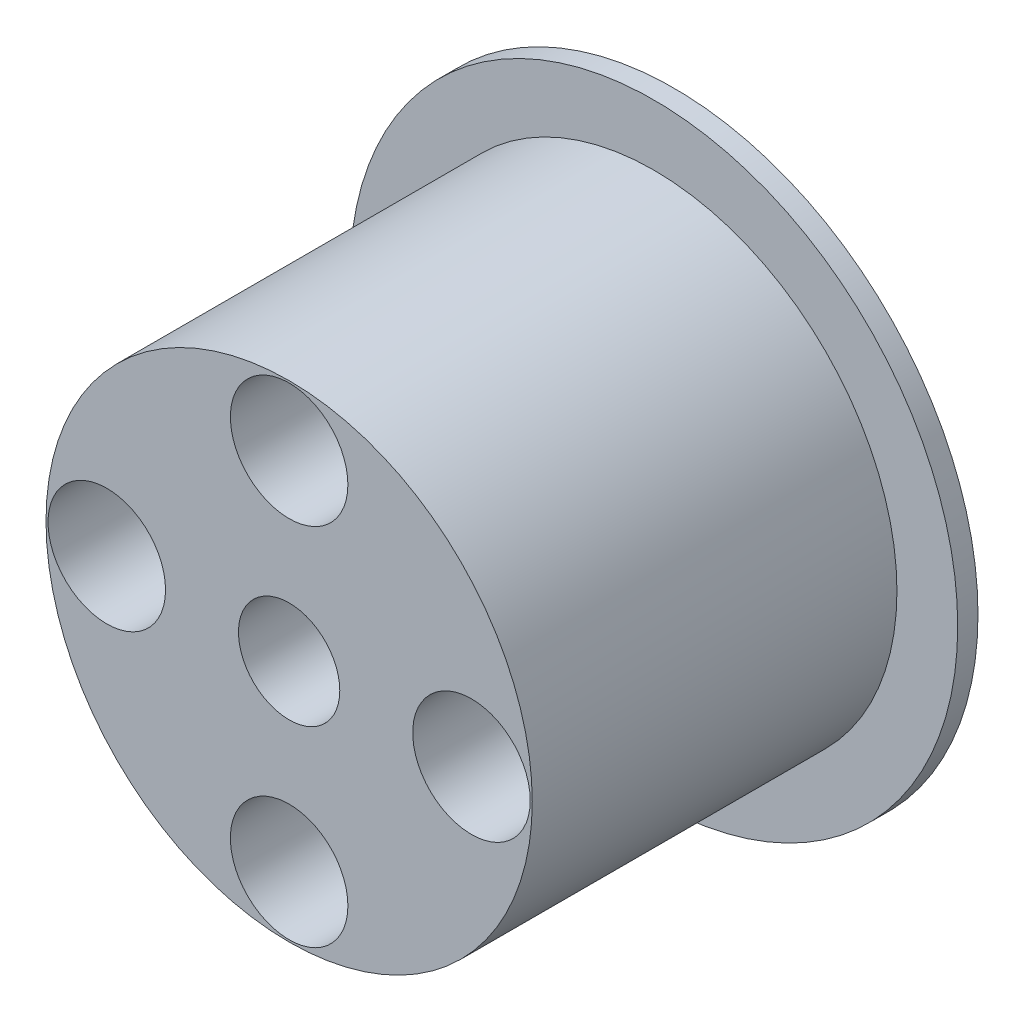
ISO-10303-21;
HEADER;
FILE_DESCRIPTION(('STEP AP214'),'2;1');
FILE_NAME('part.step','',(''),(''),'','','');
FILE_SCHEMA(('AUTOMOTIVE_DESIGN { 1 0 10303 214 1 1 1 1 }'));
ENDSEC;
DATA;
#1=APPLICATION_CONTEXT('core data for automotive mechanical design processes');
#2=APPLICATION_PROTOCOL_DEFINITION('international standard','automotive_design',2000,#1);
#3=PRODUCT_CONTEXT('',#1,'mechanical');
#4=PRODUCT('Part','Part','',(#3));
#5=PRODUCT_RELATED_PRODUCT_CATEGORY('part','',(#4));
#6=PRODUCT_DEFINITION_FORMATION('','',#4);
#7=PRODUCT_DEFINITION_CONTEXT('part definition',#1,'design');
#8=PRODUCT_DEFINITION('design','',#6,#7);
#9=PRODUCT_DEFINITION_SHAPE('','',#8);
#10=(LENGTH_UNIT() NAMED_UNIT(*) SI_UNIT(.MILLI.,.METRE.));
#11=(NAMED_UNIT(*) PLANE_ANGLE_UNIT() SI_UNIT($,.RADIAN.));
#12=(NAMED_UNIT(*) SI_UNIT($,.STERADIAN.) SOLID_ANGLE_UNIT());
#13=UNCERTAINTY_MEASURE_WITH_UNIT(LENGTH_MEASURE(1.E-05),#10,'distance_accuracy_value','');
#14=(GEOMETRIC_REPRESENTATION_CONTEXT(3) GLOBAL_UNCERTAINTY_ASSIGNED_CONTEXT((#13)) GLOBAL_UNIT_ASSIGNED_CONTEXT((#10,
#11,#12)) REPRESENTATION_CONTEXT('',''));
#15=CARTESIAN_POINT('',(0.,0.,0.));
#16=DIRECTION('',(0.,0.,1.));
#17=DIRECTION('',(1.,0.,0.));
#18=AXIS2_PLACEMENT_3D('',#15,#16,#17);
#19=CARTESIAN_POINT('',(0.,2.,-5.));
#20=DIRECTION('',(0.,-1.,0.));
#21=DIRECTION('',(0.,0.,-1.));
#22=AXIS2_PLACEMENT_3D('',#19,#20,#21);
#23=PLANE('',#22);
#24=DIRECTION('',(0.,0.,1.));
#25=VECTOR('',#24,1.);
#26=CARTESIAN_POINT('',(1.5,2.,-5.));
#27=LINE('',#26,#25);
#28=CARTESIAN_POINT('',(1.5,2.,-1.));
#29=VERTEX_POINT('',#28);
#30=CARTESIAN_POINT('',(1.5,2.,13.));
#31=VERTEX_POINT('',#30);
#32=EDGE_CURVE('E88',#29,#31,#27,.T.);
#33=ORIENTED_EDGE('',*,*,#32,.T.);
#34=DIRECTION('',(-1.,0.,0.));
#35=VECTOR('',#34,1.);
#36=CARTESIAN_POINT('',(0.,2.,13.));
#37=LINE('',#36,#35);
#38=CARTESIAN_POINT('',(-1.5,2.,13.));
#39=VERTEX_POINT('',#38);
#40=EDGE_CURVE('E93',#31,#39,#37,.T.);
#41=ORIENTED_EDGE('',*,*,#40,.T.);
#42=DIRECTION('',(0.,0.,1.));
#43=VECTOR('',#42,1.);
#44=CARTESIAN_POINT('',(-1.5,2.,-5.));
#45=LINE('',#44,#43);
#46=CARTESIAN_POINT('',(-1.5,2.,-1.));
#47=VERTEX_POINT('',#46);
#48=EDGE_CURVE('E101',#47,#39,#45,.T.);
#49=ORIENTED_EDGE('',*,*,#48,.F.);
#50=DIRECTION('',(-1.,0.,0.));
#51=VECTOR('',#50,1.);
#52=CARTESIAN_POINT('',(0.,2.,-1.));
#53=LINE('',#52,#51);
#54=EDGE_CURVE('E13',#29,#47,#53,.T.);
#55=ORIENTED_EDGE('',*,*,#54,.F.);
#56=EDGE_LOOP('',(#33,#41,#49,#55));
#57=FACE_BOUND('',#56,.T.);
#58=ADVANCED_FACE('F67',(#57),#23,.T.);
#59=CARTESIAN_POINT('',(0.,0.,18.));
#60=DIRECTION('',(0.,0.,1.));
#61=DIRECTION('',(1.,0.,0.));
#62=AXIS2_PLACEMENT_3D('',#59,#60,#61);
#63=PLANE('',#62);
#64=CARTESIAN_POINT('',(0.,0.,18.));
#65=DIRECTION('',(0.,0.,1.));
#66=DIRECTION('',(1.,0.,0.));
#67=AXIS2_PLACEMENT_3D('',#64,#65,#66);
#68=CIRCLE('',#67,2.5);
#69=CARTESIAN_POINT('',(2.5,0.,18.));
#70=VERTEX_POINT('',#69);
#71=EDGE_CURVE('E98',#70,#70,#68,.T.);
#72=ORIENTED_EDGE('',*,*,#71,.F.);
#73=EDGE_LOOP('',(#72));
#74=FACE_BOUND('',#73,.T.);
#75=CARTESIAN_POINT('',(0.,9.,18.));
#76=DIRECTION('',(0.,0.,1.));
#77=DIRECTION('',(1.,0.,0.));
#78=AXIS2_PLACEMENT_3D('',#75,#76,#77);
#79=CIRCLE('',#78,2.9);
#80=CARTESIAN_POINT('',(2.90000000000009,9.,18.));
#81=VERTEX_POINT('',#80);
#82=EDGE_CURVE('E112',#81,#81,#79,.T.);
#83=ORIENTED_EDGE('',*,*,#82,.F.);
#84=EDGE_LOOP('',(#83));
#85=FACE_BOUND('',#84,.T.);
#86=CARTESIAN_POINT('',(9.,-1.25693328198353E-13,18.));
#87=DIRECTION('',(0.,0.,1.));
#88=DIRECTION('',(1.,0.,0.));
#89=AXIS2_PLACEMENT_3D('',#86,#87,#88);
#90=CIRCLE('',#89,2.9);
#91=CARTESIAN_POINT('',(11.9,-1.25693328198353E-13,18.));
#92=VERTEX_POINT('',#91);
#93=EDGE_CURVE('E116',#92,#92,#90,.T.);
#94=ORIENTED_EDGE('',*,*,#93,.F.);
#95=EDGE_LOOP('',(#94));
#96=FACE_BOUND('',#95,.T.);
#97=CARTESIAN_POINT('',(-1.57116660247941E-13,-9.,18.));
#98=DIRECTION('',(0.,0.,1.));
#99=DIRECTION('',(1.,0.,0.));
#100=AXIS2_PLACEMENT_3D('',#97,#98,#99);
#101=CIRCLE('',#100,2.9);
#102=CARTESIAN_POINT('',(2.89999999999984,-9.,18.));
#103=VERTEX_POINT('',#102);
#104=EDGE_CURVE('E123',#103,#103,#101,.T.);
#105=ORIENTED_EDGE('',*,*,#104,.F.);
#106=EDGE_LOOP('',(#105));
#107=FACE_BOUND('',#106,.T.);
#108=CARTESIAN_POINT('',(-9.,1.90274715773506E-13,18.));
#109=DIRECTION('',(0.,0.,1.));
#110=DIRECTION('',(1.,0.,0.));
#111=AXIS2_PLACEMENT_3D('',#108,#109,#110);
#112=CIRCLE('',#111,2.9);
#113=CARTESIAN_POINT('',(-6.1,1.90274715773506E-13,18.));
#114=VERTEX_POINT('',#113);
#115=EDGE_CURVE('E107',#114,#114,#112,.T.);
#116=ORIENTED_EDGE('',*,*,#115,.F.);
#117=EDGE_LOOP('',(#116));
#118=FACE_BOUND('',#117,.T.);
#119=CARTESIAN_POINT('',(0.,0.,18.));
#120=DIRECTION('',(0.,0.,1.));
#121=DIRECTION('',(1.,0.,0.));
#122=AXIS2_PLACEMENT_3D('',#119,#120,#121);
#123=CIRCLE('',#122,12.);
#124=CARTESIAN_POINT('',(12.,0.,18.));
#125=VERTEX_POINT('',#124);
#126=EDGE_CURVE('E153',#125,#125,#123,.T.);
#127=ORIENTED_EDGE('',*,*,#126,.T.);
#128=EDGE_LOOP('',(#127));
#129=FACE_BOUND('',#128,.T.);
#130=ADVANCED_FACE('F170',(#74,#85,#96,#107,#118,#129),#63,.T.);
#131=CARTESIAN_POINT('',(0.,0.,-1.));
#132=DIRECTION('',(0.,0.,-1.));
#133=DIRECTION('',(-1.,0.,0.));
#134=AXIS2_PLACEMENT_3D('',#131,#132,#133);
#135=PLANE('',#134);
#136=CARTESIAN_POINT('',(0.,-9.,-1.));
#137=DIRECTION('',(0.,0.,-1.));
#138=DIRECTION('',(-1.,0.,0.));
#139=AXIS2_PLACEMENT_3D('',#136,#137,#138);
#140=CIRCLE('',#139,1.5);
#141=CARTESIAN_POINT('',(-1.50000000000003,-9.,-1.));
#142=VERTEX_POINT('',#141);
#143=EDGE_CURVE('E136',#142,#142,#140,.T.);
#144=ORIENTED_EDGE('',*,*,#143,.F.);
#145=EDGE_LOOP('',(#144));
#146=FACE_BOUND('',#145,.T.);
#147=CARTESIAN_POINT('',(0.,9.,-1.));
#148=DIRECTION('',(0.,0.,-1.));
#149=DIRECTION('',(-1.,0.,0.));
#150=AXIS2_PLACEMENT_3D('',#147,#148,#149);
#151=CIRCLE('',#150,1.5);
#152=CARTESIAN_POINT('',(-1.4999999999999,9.,-1.));
#153=VERTEX_POINT('',#152);
#154=EDGE_CURVE('E143',#153,#153,#151,.T.);
#155=ORIENTED_EDGE('',*,*,#154,.F.);
#156=EDGE_LOOP('',(#155));
#157=FACE_BOUND('',#156,.T.);
#158=CARTESIAN_POINT('',(0.,0.,-1.));
#159=DIRECTION('',(0.,0.,-1.));
#160=DIRECTION('',(-1.,0.,0.));
#161=AXIS2_PLACEMENT_3D('',#158,#159,#160);
#162=CIRCLE('',#161,15.);
#163=CARTESIAN_POINT('',(-15.,0.,-1.));
#164=VERTEX_POINT('',#163);
#165=EDGE_CURVE('E147',#164,#164,#162,.T.);
#166=ORIENTED_EDGE('',*,*,#165,.T.);
#167=EDGE_LOOP('',(#166));
#168=FACE_BOUND('',#167,.T.);
#169=CARTESIAN_POINT('',(-9.,0.,-1.));
#170=DIRECTION('',(0.,0.,-1.));
#171=DIRECTION('',(-1.,0.,0.));
#172=AXIS2_PLACEMENT_3D('',#169,#170,#171);
#173=CIRCLE('',#172,1.5);
#174=CARTESIAN_POINT('',(-10.5,0.,-1.));
#175=VERTEX_POINT('',#174);
#176=EDGE_CURVE('E140',#175,#175,#173,.T.);
#177=ORIENTED_EDGE('',*,*,#176,.F.);
#178=EDGE_LOOP('',(#177));
#179=FACE_BOUND('',#178,.T.);
#180=CARTESIAN_POINT('',(9.,0.,-1.));
#181=DIRECTION('',(0.,0.,-1.));
#182=DIRECTION('',(-1.,0.,0.));
#183=AXIS2_PLACEMENT_3D('',#180,#181,#182);
#184=CIRCLE('',#183,1.5);
#185=CARTESIAN_POINT('',(7.5,0.,-1.));
#186=VERTEX_POINT('',#185);
#187=EDGE_CURVE('E133',#186,#186,#184,.T.);
#188=ORIENTED_EDGE('',*,*,#187,.F.);
#189=EDGE_LOOP('',(#188));
#190=FACE_BOUND('',#189,.T.);
#191=CARTESIAN_POINT('',(0.,0.,-1.));
#192=DIRECTION('',(0.,0.,-1.));
#193=DIRECTION('',(-1.,0.,0.));
#194=AXIS2_PLACEMENT_3D('',#191,#192,#193);
#195=CIRCLE('',#194,2.5);
#196=EDGE_CURVE('E75',#29,#47,#195,.T.);
#197=ORIENTED_EDGE('',*,*,#196,.F.);
#198=ORIENTED_EDGE('',*,*,#54,.T.);
#199=EDGE_LOOP('',(#197,#198));
#200=FACE_BOUND('',#199,.T.);
#201=ADVANCED_FACE('F168',(#146,#157,#168,#179,#190,#200),#135,.T.);
#202=CARTESIAN_POINT('',(0.,0.,18.));
#203=DIRECTION('',(0.,0.,-1.));
#204=DIRECTION('',(-1.,0.,0.));
#205=AXIS2_PLACEMENT_3D('',#202,#203,#204);
#206=CYLINDRICAL_SURFACE('',#205,12.);
#207=ORIENTED_EDGE('',*,*,#126,.F.);
#208=EDGE_LOOP('',(#207));
#209=FACE_BOUND('',#208,.T.);
#210=CARTESIAN_POINT('',(0.,0.,0.));
#211=DIRECTION('',(0.,0.,1.));
#212=DIRECTION('',(1.,0.,0.));
#213=AXIS2_PLACEMENT_3D('',#210,#211,#212);
#214=CIRCLE('',#213,12.);
#215=CARTESIAN_POINT('',(12.,0.,0.));
#216=VERTEX_POINT('',#215);
#217=EDGE_CURVE('E150',#216,#216,#214,.T.);
#218=ORIENTED_EDGE('',*,*,#217,.T.);
#219=EDGE_LOOP('',(#218));
#220=FACE_BOUND('',#219,.T.);
#221=ADVANCED_FACE('F69',(#209,#220),#206,.T.);
#222=CARTESIAN_POINT('',(-9.,0.,18.));
#223=DIRECTION('',(0.,0.,-1.));
#224=DIRECTION('',(-1.,0.,0.));
#225=AXIS2_PLACEMENT_3D('',#222,#223,#224);
#226=CYLINDRICAL_SURFACE('',#225,1.5);
#227=CARTESIAN_POINT('',(-9.,0.,4.));
#228=DIRECTION('',(0.,0.,-1.));
#229=DIRECTION('',(-1.,0.,0.));
#230=AXIS2_PLACEMENT_3D('',#227,#228,#229);
#231=CIRCLE('',#230,1.5);
#232=CARTESIAN_POINT('',(-10.5,0.,4.));
#233=VERTEX_POINT('',#232);
#234=EDGE_CURVE('E137',#233,#233,#231,.T.);
#235=ORIENTED_EDGE('',*,*,#234,.F.);
#236=EDGE_LOOP('',(#235));
#237=FACE_BOUND('',#236,.T.);
#238=ORIENTED_EDGE('',*,*,#176,.T.);
#239=EDGE_LOOP('',(#238));
#240=FACE_BOUND('',#239,.T.);
#241=ADVANCED_FACE('F178',(#237,#240),#226,.F.);
#242=CARTESIAN_POINT('',(9.,0.,18.));
#243=DIRECTION('',(0.,0.,-1.));
#244=DIRECTION('',(-1.,0.,0.));
#245=AXIS2_PLACEMENT_3D('',#242,#243,#244);
#246=CYLINDRICAL_SURFACE('',#245,1.5);
#247=CARTESIAN_POINT('',(9.,0.,4.));
#248=DIRECTION('',(0.,0.,-1.));
#249=DIRECTION('',(-1.,0.,0.));
#250=AXIS2_PLACEMENT_3D('',#247,#248,#249);
#251=CIRCLE('',#250,1.5);
#252=CARTESIAN_POINT('',(7.5,0.,4.));
#253=VERTEX_POINT('',#252);
#254=EDGE_CURVE('E163',#253,#253,#251,.T.);
#255=ORIENTED_EDGE('',*,*,#254,.F.);
#256=EDGE_LOOP('',(#255));
#257=FACE_BOUND('',#256,.T.);
#258=ORIENTED_EDGE('',*,*,#187,.T.);
#259=EDGE_LOOP('',(#258));
#260=FACE_BOUND('',#259,.T.);
#261=ADVANCED_FACE('F256',(#257,#260),#246,.F.);
#262=CARTESIAN_POINT('',(0.,9.,18.));
#263=DIRECTION('',(0.,0.,-1.));
#264=DIRECTION('',(-1.,0.,0.));
#265=AXIS2_PLACEMENT_3D('',#262,#263,#264);
#266=CYLINDRICAL_SURFACE('',#265,1.5);
#267=CARTESIAN_POINT('',(0.,9.,4.));
#268=DIRECTION('',(0.,0.,-1.));
#269=DIRECTION('',(-1.,0.,0.));
#270=AXIS2_PLACEMENT_3D('',#267,#268,#269);
#271=CIRCLE('',#270,1.5);
#272=CARTESIAN_POINT('',(-1.4999999999999,9.,4.));
#273=VERTEX_POINT('',#272);
#274=EDGE_CURVE('E160',#273,#273,#271,.T.);
#275=ORIENTED_EDGE('',*,*,#274,.F.);
#276=EDGE_LOOP('',(#275));
#277=FACE_BOUND('',#276,.T.);
#278=ORIENTED_EDGE('',*,*,#154,.T.);
#279=EDGE_LOOP('',(#278));
#280=FACE_BOUND('',#279,.T.);
#281=ADVANCED_FACE('F252',(#277,#280),#266,.F.);
#282=CARTESIAN_POINT('',(0.,-9.,18.));
#283=DIRECTION('',(0.,0.,-1.));
#284=DIRECTION('',(-1.,0.,0.));
#285=AXIS2_PLACEMENT_3D('',#282,#283,#284);
#286=CYLINDRICAL_SURFACE('',#285,1.5);
#287=CARTESIAN_POINT('',(0.,-9.,4.));
#288=DIRECTION('',(0.,0.,-1.));
#289=DIRECTION('',(-1.,0.,0.));
#290=AXIS2_PLACEMENT_3D('',#287,#288,#289);
#291=CIRCLE('',#290,1.5);
#292=CARTESIAN_POINT('',(-1.50000000000003,-9.,4.));
#293=VERTEX_POINT('',#292);
#294=EDGE_CURVE('E119',#293,#293,#291,.T.);
#295=ORIENTED_EDGE('',*,*,#294,.F.);
#296=EDGE_LOOP('',(#295));
#297=FACE_BOUND('',#296,.T.);
#298=ORIENTED_EDGE('',*,*,#143,.T.);
#299=EDGE_LOOP('',(#298));
#300=FACE_BOUND('',#299,.T.);
#301=ADVANCED_FACE('F239',(#297,#300),#286,.F.);
#302=CARTESIAN_POINT('',(0.,0.,0.));
#303=DIRECTION('',(0.,0.,-1.));
#304=DIRECTION('',(-1.,0.,0.));
#305=AXIS2_PLACEMENT_3D('',#302,#303,#304);
#306=PLANE('',#305);
#307=ORIENTED_EDGE('',*,*,#217,.F.);
#308=EDGE_LOOP('',(#307));
#309=FACE_BOUND('',#308,.T.);
#310=CARTESIAN_POINT('',(0.,0.,0.));
#311=DIRECTION('',(0.,0.,-1.));
#312=DIRECTION('',(-1.,0.,0.));
#313=AXIS2_PLACEMENT_3D('',#310,#311,#312);
#314=CIRCLE('',#313,15.);
#315=CARTESIAN_POINT('',(-15.,0.,0.));
#316=VERTEX_POINT('',#315);
#317=EDGE_CURVE('E146',#316,#316,#314,.T.);
#318=ORIENTED_EDGE('',*,*,#317,.F.);
#319=EDGE_LOOP('',(#318));
#320=FACE_BOUND('',#319,.T.);
#321=ADVANCED_FACE('F236',(#309,#320),#306,.F.);
#322=CARTESIAN_POINT('',(0.,0.,-1.));
#323=DIRECTION('',(0.,0.,1.));
#324=DIRECTION('',(1.,0.,0.));
#325=AXIS2_PLACEMENT_3D('',#322,#323,#324);
#326=CYLINDRICAL_SURFACE('',#325,15.);
#327=ORIENTED_EDGE('',*,*,#165,.F.);
#328=EDGE_LOOP('',(#327));
#329=FACE_BOUND('',#328,.T.);
#330=ORIENTED_EDGE('',*,*,#317,.T.);
#331=EDGE_LOOP('',(#330));
#332=FACE_BOUND('',#331,.T.);
#333=ADVANCED_FACE('F213',(#329,#332),#326,.T.);
#334=CARTESIAN_POINT('',(0.,0.,4.));
#335=DIRECTION('',(0.,0.,-1.));
#336=DIRECTION('',(-1.,0.,0.));
#337=AXIS2_PLACEMENT_3D('',#334,#335,#336);
#338=PLANE('',#337);
#339=ORIENTED_EDGE('',*,*,#294,.T.);
#340=EDGE_LOOP('',(#339));
#341=FACE_BOUND('',#340,.T.);
#342=CARTESIAN_POINT('',(-1.57116660247941E-13,-9.,4.));
#343=DIRECTION('',(0.,0.,-1.));
#344=DIRECTION('',(-1.,0.,0.));
#345=AXIS2_PLACEMENT_3D('',#342,#343,#344);
#346=CIRCLE('',#345,2.9);
#347=CARTESIAN_POINT('',(-2.90000000000016,-9.,4.));
#348=VERTEX_POINT('',#347);
#349=EDGE_CURVE('E126',#348,#348,#346,.F.);
#350=ORIENTED_EDGE('',*,*,#349,.T.);
#351=EDGE_LOOP('',(#350));
#352=FACE_BOUND('',#351,.T.);
#353=ADVANCED_FACE('F210',(#341,#352),#338,.F.);
#354=CARTESIAN_POINT('',(-1.57116660247941E-13,-9.,-9.20243866176395));
#355=DIRECTION('',(0.,0.,1.));
#356=DIRECTION('',(1.,0.,0.));
#357=AXIS2_PLACEMENT_3D('',#354,#355,#356);
#358=CYLINDRICAL_SURFACE('',#357,2.9);
#359=ORIENTED_EDGE('',*,*,#104,.T.);
#360=EDGE_LOOP('',(#359));
#361=FACE_BOUND('',#360,.T.);
#362=ORIENTED_EDGE('',*,*,#349,.F.);
#363=EDGE_LOOP('',(#362));
#364=FACE_BOUND('',#363,.T.);
#365=ADVANCED_FACE('F200',(#361,#364),#358,.F.);
#366=CARTESIAN_POINT('',(0.,0.,4.));
#367=DIRECTION('',(0.,0.,-1.));
#368=DIRECTION('',(-1.,0.,0.));
#369=AXIS2_PLACEMENT_3D('',#366,#367,#368);
#370=PLANE('',#369);
#371=ORIENTED_EDGE('',*,*,#274,.T.);
#372=EDGE_LOOP('',(#371));
#373=FACE_BOUND('',#372,.T.);
#374=CARTESIAN_POINT('',(0.,9.,4.));
#375=DIRECTION('',(0.,0.,-1.));
#376=DIRECTION('',(-1.,0.,0.));
#377=AXIS2_PLACEMENT_3D('',#374,#375,#376);
#378=CIRCLE('',#377,2.9);
#379=CARTESIAN_POINT('',(-2.89999999999991,9.,4.));
#380=VERTEX_POINT('',#379);
#381=EDGE_CURVE('E115',#380,#380,#378,.F.);
#382=ORIENTED_EDGE('',*,*,#381,.T.);
#383=EDGE_LOOP('',(#382));
#384=FACE_BOUND('',#383,.T.);
#385=ADVANCED_FACE('F196',(#373,#384),#370,.F.);
#386=CARTESIAN_POINT('',(0.,9.,-9.20243866176395));
#387=DIRECTION('',(0.,0.,1.));
#388=DIRECTION('',(1.,0.,0.));
#389=AXIS2_PLACEMENT_3D('',#386,#387,#388);
#390=CYLINDRICAL_SURFACE('',#389,2.9);
#391=ORIENTED_EDGE('',*,*,#82,.T.);
#392=EDGE_LOOP('',(#391));
#393=FACE_BOUND('',#392,.T.);
#394=ORIENTED_EDGE('',*,*,#381,.F.);
#395=EDGE_LOOP('',(#394));
#396=FACE_BOUND('',#395,.T.);
#397=ADVANCED_FACE('F192',(#393,#396),#390,.F.);
#398=CARTESIAN_POINT('',(0.,0.,4.));
#399=DIRECTION('',(0.,0.,-1.));
#400=DIRECTION('',(-1.,0.,0.));
#401=AXIS2_PLACEMENT_3D('',#398,#399,#400);
#402=PLANE('',#401);
#403=ORIENTED_EDGE('',*,*,#254,.T.);
#404=EDGE_LOOP('',(#403));
#405=FACE_BOUND('',#404,.T.);
#406=CARTESIAN_POINT('',(9.,-1.25693328198353E-13,4.));
#407=DIRECTION('',(0.,0.,-1.));
#408=DIRECTION('',(-1.,0.,0.));
#409=AXIS2_PLACEMENT_3D('',#406,#407,#408);
#410=CIRCLE('',#409,2.9);
#411=CARTESIAN_POINT('',(6.1,-1.25693328198353E-13,4.));
#412=VERTEX_POINT('',#411);
#413=EDGE_CURVE('E120',#412,#412,#410,.F.);
#414=ORIENTED_EDGE('',*,*,#413,.T.);
#415=EDGE_LOOP('',(#414));
#416=FACE_BOUND('',#415,.T.);
#417=ADVANCED_FACE('F195',(#405,#416),#402,.F.);
#418=CARTESIAN_POINT('',(9.,-1.25693328198353E-13,-9.20243866176395));
#419=DIRECTION('',(0.,0.,1.));
#420=DIRECTION('',(1.,0.,0.));
#421=AXIS2_PLACEMENT_3D('',#418,#419,#420);
#422=CYLINDRICAL_SURFACE('',#421,2.9);
#423=ORIENTED_EDGE('',*,*,#93,.T.);
#424=EDGE_LOOP('',(#423));
#425=FACE_BOUND('',#424,.T.);
#426=ORIENTED_EDGE('',*,*,#413,.F.);
#427=EDGE_LOOP('',(#426));
#428=FACE_BOUND('',#427,.T.);
#429=ADVANCED_FACE('F204',(#425,#428),#422,.F.);
#430=CARTESIAN_POINT('',(0.,0.,4.));
#431=DIRECTION('',(0.,0.,-1.));
#432=DIRECTION('',(-1.,0.,0.));
#433=AXIS2_PLACEMENT_3D('',#430,#431,#432);
#434=PLANE('',#433);
#435=ORIENTED_EDGE('',*,*,#234,.T.);
#436=EDGE_LOOP('',(#435));
#437=FACE_BOUND('',#436,.T.);
#438=CARTESIAN_POINT('',(-9.,1.90274715773506E-13,4.));
#439=DIRECTION('',(0.,0.,-1.));
#440=DIRECTION('',(-1.,0.,0.));
#441=AXIS2_PLACEMENT_3D('',#438,#439,#440);
#442=CIRCLE('',#441,2.9);
#443=CARTESIAN_POINT('',(-11.9,1.90274715773506E-13,4.));
#444=VERTEX_POINT('',#443);
#445=EDGE_CURVE('E104',#444,#444,#442,.F.);
#446=ORIENTED_EDGE('',*,*,#445,.T.);
#447=EDGE_LOOP('',(#446));
#448=FACE_BOUND('',#447,.T.);
#449=ADVANCED_FACE('F208',(#437,#448),#434,.F.);
#450=CARTESIAN_POINT('',(-9.,1.90274715773506E-13,-9.20243866176395));
#451=DIRECTION('',(0.,0.,1.));
#452=DIRECTION('',(1.,0.,0.));
#453=AXIS2_PLACEMENT_3D('',#450,#451,#452);
#454=CYLINDRICAL_SURFACE('',#453,2.9);
#455=ORIENTED_EDGE('',*,*,#115,.T.);
#456=EDGE_LOOP('',(#455));
#457=FACE_BOUND('',#456,.T.);
#458=ORIENTED_EDGE('',*,*,#445,.F.);
#459=EDGE_LOOP('',(#458));
#460=FACE_BOUND('',#459,.T.);
#461=ADVANCED_FACE('F219',(#457,#460),#454,.F.);
#462=CARTESIAN_POINT('',(0.,0.,-5.));
#463=DIRECTION('',(0.,0.,1.));
#464=DIRECTION('',(1.,0.,0.));
#465=AXIS2_PLACEMENT_3D('',#462,#463,#464);
#466=CYLINDRICAL_SURFACE('',#465,2.5);
#467=ORIENTED_EDGE('',*,*,#71,.T.);
#468=EDGE_LOOP('',(#467));
#469=FACE_BOUND('',#468,.T.);
#470=CARTESIAN_POINT('',(0.,0.,13.));
#471=DIRECTION('',(0.,0.,1.));
#472=DIRECTION('',(1.,0.,0.));
#473=AXIS2_PLACEMENT_3D('',#470,#471,#472);
#474=CIRCLE('',#473,2.5);
#475=EDGE_CURVE('E81',#31,#39,#474,.T.);
#476=ORIENTED_EDGE('',*,*,#475,.F.);
#477=ORIENTED_EDGE('',*,*,#32,.F.);
#478=ORIENTED_EDGE('',*,*,#196,.T.);
#479=ORIENTED_EDGE('',*,*,#48,.T.);
#480=EDGE_LOOP('',(#476,#477,#478,#479));
#481=FACE_BOUND('',#480,.T.);
#482=ADVANCED_FACE('F100',(#469,#481),#466,.F.);
#483=CARTESIAN_POINT('',(0.,0.,13.));
#484=DIRECTION('',(0.,0.,1.));
#485=DIRECTION('',(1.,0.,0.));
#486=AXIS2_PLACEMENT_3D('',#483,#484,#485);
#487=PLANE('',#486);
#488=ORIENTED_EDGE('',*,*,#475,.T.);
#489=ORIENTED_EDGE('',*,*,#40,.F.);
#490=EDGE_LOOP('',(#488,#489));
#491=FACE_BOUND('',#490,.T.);
#492=ADVANCED_FACE('F94',(#491),#487,.T.);
#493=CLOSED_SHELL('',(#58,#130,#201,#221,#241,#261,#281,#301,#321,#333,#353,#365,#385,#397,#417,
#429,#449,#461,#482,#492));
#494=MANIFOLD_SOLID_BREP('B2',#493);
#495=ADVANCED_BREP_SHAPE_REPRESENTATION('',(#18,#494),#14);
#496=SHAPE_DEFINITION_REPRESENTATION(#9,#495);
ENDSEC;
END-ISO-10303-21;
